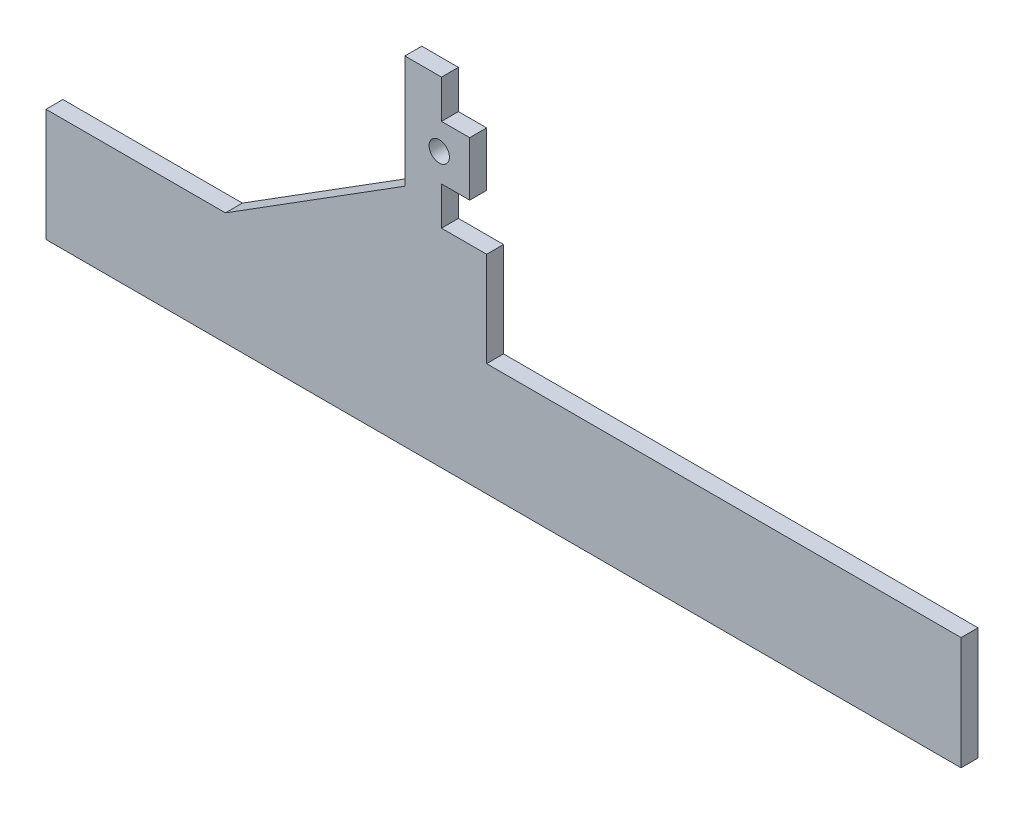
ISO-10303-21;
HEADER;
FILE_DESCRIPTION(('STEP AP214'),'2;1');
FILE_NAME('part.step','',(''),(''),'','','');
FILE_SCHEMA(('AUTOMOTIVE_DESIGN { 1 0 10303 214 1 1 1 1 }'));
ENDSEC;
DATA;
#1=APPLICATION_CONTEXT('core data for automotive mechanical design processes');
#2=APPLICATION_PROTOCOL_DEFINITION('international standard','automotive_design',2000,#1);
#3=PRODUCT_CONTEXT('',#1,'mechanical');
#4=PRODUCT('Part','Part','',(#3));
#5=PRODUCT_RELATED_PRODUCT_CATEGORY('part','',(#4));
#6=PRODUCT_DEFINITION_FORMATION('','',#4);
#7=PRODUCT_DEFINITION_CONTEXT('part definition',#1,'design');
#8=PRODUCT_DEFINITION('design','',#6,#7);
#9=PRODUCT_DEFINITION_SHAPE('','',#8);
#10=(LENGTH_UNIT() NAMED_UNIT(*) SI_UNIT(.MILLI.,.METRE.));
#11=(NAMED_UNIT(*) PLANE_ANGLE_UNIT() SI_UNIT($,.RADIAN.));
#12=(NAMED_UNIT(*) SI_UNIT($,.STERADIAN.) SOLID_ANGLE_UNIT());
#13=UNCERTAINTY_MEASURE_WITH_UNIT(LENGTH_MEASURE(1.E-05),#10,'distance_accuracy_value','');
#14=(GEOMETRIC_REPRESENTATION_CONTEXT(3) GLOBAL_UNCERTAINTY_ASSIGNED_CONTEXT((#13)) GLOBAL_UNIT_ASSIGNED_CONTEXT((#10,
#11,#12)) REPRESENTATION_CONTEXT('',''));
#15=CARTESIAN_POINT('',(0.,0.,0.));
#16=DIRECTION('',(0.,0.,1.));
#17=DIRECTION('',(1.,0.,0.));
#18=AXIS2_PLACEMENT_3D('',#15,#16,#17);
#19=CARTESIAN_POINT('',(0.,0.,15.));
#20=DIRECTION('',(0.,0.,1.));
#21=DIRECTION('',(1.,0.,0.));
#22=AXIS2_PLACEMENT_3D('',#19,#20,#21);
#23=PLANE('',#22);
#24=DIRECTION('',(-1.,0.,0.));
#25=VECTOR('',#24,1.);
#26=CARTESIAN_POINT('',(-15.,50.,15.));
#27=LINE('',#26,#25);
#28=CARTESIAN_POINT('',(405.6,50.,15.));
#29=VERTEX_POINT('',#28);
#30=CARTESIAN_POINT('',(-15.,50.,15.));
#31=VERTEX_POINT('',#30);
#32=EDGE_CURVE('E201',#29,#31,#27,.T.);
#33=ORIENTED_EDGE('',*,*,#32,.T.);
#34=DIRECTION('',(0.,1.,0.));
#35=VECTOR('',#34,1.);
#36=CARTESIAN_POINT('',(-15.,50.,15.));
#37=LINE('',#36,#35);
#38=CARTESIAN_POINT('',(-15.,134.,15.));
#39=VERTEX_POINT('',#38);
#40=EDGE_CURVE('E114',#31,#39,#37,.T.);
#41=ORIENTED_EDGE('',*,*,#40,.T.);
#42=DIRECTION('',(-1.,0.,0.));
#43=VECTOR('',#42,1.);
#44=CARTESIAN_POINT('',(-15.,134.,15.));
#45=LINE('',#44,#43);
#46=CARTESIAN_POINT('',(-55.,134.,15.));
#47=VERTEX_POINT('',#46);
#48=EDGE_CURVE('E237',#39,#47,#45,.T.);
#49=ORIENTED_EDGE('',*,*,#48,.T.);
#50=DIRECTION('',(0.,1.,0.));
#51=VECTOR('',#50,1.);
#52=CARTESIAN_POINT('',(-55.,134.,15.));
#53=LINE('',#52,#51);
#54=CARTESIAN_POINT('',(-55.,168.,15.));
#55=VERTEX_POINT('',#54);
#56=EDGE_CURVE('E256',#47,#55,#53,.T.);
#57=ORIENTED_EDGE('',*,*,#56,.T.);
#58=DIRECTION('',(1.,0.,0.));
#59=VECTOR('',#58,1.);
#60=CARTESIAN_POINT('',(-30.,168.,15.));
#61=LINE('',#60,#59);
#62=CARTESIAN_POINT('',(-30.,168.,15.));
#63=VERTEX_POINT('',#62);
#64=EDGE_CURVE('E253',#55,#63,#61,.T.);
#65=ORIENTED_EDGE('',*,*,#64,.T.);
#66=DIRECTION('',(0.,1.,0.));
#67=VECTOR('',#66,1.);
#68=CARTESIAN_POINT('',(-30.,168.,15.));
#69=LINE('',#68,#67);
#70=CARTESIAN_POINT('',(-30.,216.,15.));
#71=VERTEX_POINT('',#70);
#72=EDGE_CURVE('E255',#63,#71,#69,.T.);
#73=ORIENTED_EDGE('',*,*,#72,.T.);
#74=DIRECTION('',(-1.,0.,0.));
#75=VECTOR('',#74,1.);
#76=CARTESIAN_POINT('',(-30.,216.,15.));
#77=LINE('',#76,#75);
#78=CARTESIAN_POINT('',(-55.,216.,15.));
#79=VERTEX_POINT('',#78);
#80=EDGE_CURVE('E258',#71,#79,#77,.T.);
#81=ORIENTED_EDGE('',*,*,#80,.T.);
#82=DIRECTION('',(0.,1.,0.));
#83=VECTOR('',#82,1.);
#84=CARTESIAN_POINT('',(-55.,250.,15.));
#85=LINE('',#84,#83);
#86=CARTESIAN_POINT('',(-55.,250.,15.));
#87=VERTEX_POINT('',#86);
#88=EDGE_CURVE('E264',#79,#87,#85,.T.);
#89=ORIENTED_EDGE('',*,*,#88,.T.);
#90=DIRECTION('',(-1.,0.,0.));
#91=VECTOR('',#90,1.);
#92=CARTESIAN_POINT('',(-55.,250.,15.));
#93=LINE('',#92,#91);
#94=CARTESIAN_POINT('',(-87.48,250.,15.));
#95=VERTEX_POINT('',#94);
#96=EDGE_CURVE('E266',#87,#95,#93,.T.);
#97=ORIENTED_EDGE('',*,*,#96,.T.);
#98=DIRECTION('',(0.,-1.,0.));
#99=VECTOR('',#98,1.);
#100=CARTESIAN_POINT('',(-87.48,250.,15.));
#101=LINE('',#100,#99);
#102=CARTESIAN_POINT('',(-87.48,150.,15.));
#103=VERTEX_POINT('',#102);
#104=EDGE_CURVE('E268',#95,#103,#101,.T.);
#105=ORIENTED_EDGE('',*,*,#104,.T.);
#106=DIRECTION('',(-0.846589955005853,-0.532245665161482,0.));
#107=VECTOR('',#106,1.);
#108=CARTESIAN_POINT('',(-87.48,150.,15.));
#109=LINE('',#108,#107);
#110=CARTESIAN_POINT('',(-246.54,50.,15.));
#111=VERTEX_POINT('',#110);
#112=EDGE_CURVE('E270',#103,#111,#109,.T.);
#113=ORIENTED_EDGE('',*,*,#112,.T.);
#114=DIRECTION('',(-1.,0.,0.));
#115=VECTOR('',#114,1.);
#116=CARTESIAN_POINT('',(-405.6,50.,15.));
#117=LINE('',#116,#115);
#118=CARTESIAN_POINT('',(-405.6,50.,15.));
#119=VERTEX_POINT('',#118);
#120=EDGE_CURVE('E154',#111,#119,#117,.T.);
#121=ORIENTED_EDGE('',*,*,#120,.T.);
#122=DIRECTION('',(0.,-1.,0.));
#123=VECTOR('',#122,1.);
#124=CARTESIAN_POINT('',(-405.6,-50.,15.));
#125=LINE('',#124,#123);
#126=CARTESIAN_POINT('',(-405.6,-50.,15.));
#127=VERTEX_POINT('',#126);
#128=EDGE_CURVE('E148',#119,#127,#125,.T.);
#129=ORIENTED_EDGE('',*,*,#128,.T.);
#130=DIRECTION('',(1.,0.,0.));
#131=VECTOR('',#130,1.);
#132=CARTESIAN_POINT('',(-405.6,-50.,15.));
#133=LINE('',#132,#131);
#134=CARTESIAN_POINT('',(405.6,-50.,15.));
#135=VERTEX_POINT('',#134);
#136=EDGE_CURVE('E152',#127,#135,#133,.T.);
#137=ORIENTED_EDGE('',*,*,#136,.T.);
#138=DIRECTION('',(0.,1.,0.));
#139=VECTOR('',#138,1.);
#140=CARTESIAN_POINT('',(405.6,-50.,15.));
#141=LINE('',#140,#139);
#142=EDGE_CURVE('E50',#135,#29,#141,.T.);
#143=ORIENTED_EDGE('',*,*,#142,.T.);
#144=EDGE_LOOP('',(#33,#41,#49,#57,#65,#73,#81,#89,#97,#105,#113,#121,#129,#137,#143));
#145=FACE_BOUND('',#144,.T.);
#146=CARTESIAN_POINT('',(-56.98,192.,15.));
#147=DIRECTION('',(0.,0.,1.));
#148=DIRECTION('',(1.,0.,0.));
#149=AXIS2_PLACEMENT_3D('',#146,#147,#148);
#150=CIRCLE('',#149,9.00000000000001);
#151=CARTESIAN_POINT('',(-47.98,192.,15.));
#152=VERTEX_POINT('',#151);
#153=EDGE_CURVE('E176',#152,#152,#150,.T.);
#154=ORIENTED_EDGE('',*,*,#153,.F.);
#155=EDGE_LOOP('',(#154));
#156=FACE_BOUND('',#155,.T.);
#157=ADVANCED_FACE('F33',(#145,#156),#23,.T.);
#158=CARTESIAN_POINT('',(0.,0.,0.));
#159=DIRECTION('',(0.,0.,1.));
#160=DIRECTION('',(1.,0.,0.));
#161=AXIS2_PLACEMENT_3D('',#158,#159,#160);
#162=PLANE('',#161);
#163=DIRECTION('',(-1.,0.,0.));
#164=VECTOR('',#163,1.);
#165=CARTESIAN_POINT('',(-15.,50.,0.));
#166=LINE('',#165,#164);
#167=CARTESIAN_POINT('',(405.6,50.,0.));
#168=VERTEX_POINT('',#167);
#169=CARTESIAN_POINT('',(-15.,50.,0.));
#170=VERTEX_POINT('',#169);
#171=EDGE_CURVE('E172',#168,#170,#166,.T.);
#172=ORIENTED_EDGE('',*,*,#171,.F.);
#173=DIRECTION('',(0.,1.,0.));
#174=VECTOR('',#173,1.);
#175=CARTESIAN_POINT('',(405.6,-50.,0.));
#176=LINE('',#175,#174);
#177=CARTESIAN_POINT('',(405.6,-50.,0.));
#178=VERTEX_POINT('',#177);
#179=EDGE_CURVE('E106',#178,#168,#176,.T.);
#180=ORIENTED_EDGE('',*,*,#179,.F.);
#181=DIRECTION('',(1.,0.,0.));
#182=VECTOR('',#181,1.);
#183=CARTESIAN_POINT('',(-405.6,-50.,0.));
#184=LINE('',#183,#182);
#185=CARTESIAN_POINT('',(-405.6,-50.,0.));
#186=VERTEX_POINT('',#185);
#187=EDGE_CURVE('E100',#186,#178,#184,.T.);
#188=ORIENTED_EDGE('',*,*,#187,.F.);
#189=DIRECTION('',(0.,-1.,0.));
#190=VECTOR('',#189,1.);
#191=CARTESIAN_POINT('',(-405.6,-50.,0.));
#192=LINE('',#191,#190);
#193=CARTESIAN_POINT('',(-405.6,50.,0.));
#194=VERTEX_POINT('',#193);
#195=EDGE_CURVE('E162',#194,#186,#192,.T.);
#196=ORIENTED_EDGE('',*,*,#195,.F.);
#197=DIRECTION('',(-1.,0.,0.));
#198=VECTOR('',#197,1.);
#199=CARTESIAN_POINT('',(-405.6,50.,0.));
#200=LINE('',#199,#198);
#201=CARTESIAN_POINT('',(-246.54,50.,0.));
#202=VERTEX_POINT('',#201);
#203=EDGE_CURVE('E196',#202,#194,#200,.T.);
#204=ORIENTED_EDGE('',*,*,#203,.F.);
#205=DIRECTION('',(-0.846589955005853,-0.532245665161482,0.));
#206=VECTOR('',#205,1.);
#207=CARTESIAN_POINT('',(-87.48,150.,0.));
#208=LINE('',#207,#206);
#209=CARTESIAN_POINT('',(-87.48,150.,0.));
#210=VERTEX_POINT('',#209);
#211=EDGE_CURVE('E194',#210,#202,#208,.T.);
#212=ORIENTED_EDGE('',*,*,#211,.F.);
#213=DIRECTION('',(0.,-1.,0.));
#214=VECTOR('',#213,1.);
#215=CARTESIAN_POINT('',(-87.48,250.,0.));
#216=LINE('',#215,#214);
#217=CARTESIAN_POINT('',(-87.48,250.,0.));
#218=VERTEX_POINT('',#217);
#219=EDGE_CURVE('E192',#218,#210,#216,.T.);
#220=ORIENTED_EDGE('',*,*,#219,.F.);
#221=DIRECTION('',(-1.,0.,0.));
#222=VECTOR('',#221,1.);
#223=CARTESIAN_POINT('',(-55.,250.,0.));
#224=LINE('',#223,#222);
#225=CARTESIAN_POINT('',(-55.,250.,0.));
#226=VERTEX_POINT('',#225);
#227=EDGE_CURVE('E190',#226,#218,#224,.T.);
#228=ORIENTED_EDGE('',*,*,#227,.F.);
#229=DIRECTION('',(0.,1.,0.));
#230=VECTOR('',#229,1.);
#231=CARTESIAN_POINT('',(-55.,250.,0.));
#232=LINE('',#231,#230);
#233=CARTESIAN_POINT('',(-55.,216.,0.));
#234=VERTEX_POINT('',#233);
#235=EDGE_CURVE('E188',#234,#226,#232,.T.);
#236=ORIENTED_EDGE('',*,*,#235,.F.);
#237=DIRECTION('',(-1.,0.,0.));
#238=VECTOR('',#237,1.);
#239=CARTESIAN_POINT('',(-30.,216.,0.));
#240=LINE('',#239,#238);
#241=CARTESIAN_POINT('',(-30.,216.,0.));
#242=VERTEX_POINT('',#241);
#243=EDGE_CURVE('E186',#242,#234,#240,.T.);
#244=ORIENTED_EDGE('',*,*,#243,.F.);
#245=DIRECTION('',(0.,1.,0.));
#246=VECTOR('',#245,1.);
#247=CARTESIAN_POINT('',(-30.,168.,0.));
#248=LINE('',#247,#246);
#249=CARTESIAN_POINT('',(-30.,168.,0.));
#250=VERTEX_POINT('',#249);
#251=EDGE_CURVE('E184',#250,#242,#248,.T.);
#252=ORIENTED_EDGE('',*,*,#251,.F.);
#253=DIRECTION('',(1.,0.,0.));
#254=VECTOR('',#253,1.);
#255=CARTESIAN_POINT('',(-30.,168.,0.));
#256=LINE('',#255,#254);
#257=CARTESIAN_POINT('',(-55.,168.,0.));
#258=VERTEX_POINT('',#257);
#259=EDGE_CURVE('E182',#258,#250,#256,.T.);
#260=ORIENTED_EDGE('',*,*,#259,.F.);
#261=DIRECTION('',(0.,1.,0.));
#262=VECTOR('',#261,1.);
#263=CARTESIAN_POINT('',(-55.,134.,0.));
#264=LINE('',#263,#262);
#265=CARTESIAN_POINT('',(-55.,134.,0.));
#266=VERTEX_POINT('',#265);
#267=EDGE_CURVE('E180',#266,#258,#264,.T.);
#268=ORIENTED_EDGE('',*,*,#267,.F.);
#269=DIRECTION('',(-1.,0.,0.));
#270=VECTOR('',#269,1.);
#271=CARTESIAN_POINT('',(-15.,134.,0.));
#272=LINE('',#271,#270);
#273=CARTESIAN_POINT('',(-15.,134.,0.));
#274=VERTEX_POINT('',#273);
#275=EDGE_CURVE('E178',#274,#266,#272,.T.);
#276=ORIENTED_EDGE('',*,*,#275,.F.);
#277=DIRECTION('',(0.,1.,0.));
#278=VECTOR('',#277,1.);
#279=CARTESIAN_POINT('',(-15.,50.,0.));
#280=LINE('',#279,#278);
#281=EDGE_CURVE('E175',#170,#274,#280,.T.);
#282=ORIENTED_EDGE('',*,*,#281,.F.);
#283=EDGE_LOOP('',(#172,#180,#188,#196,#204,#212,#220,#228,#236,#244,#252,#260,#268,#276,#282));
#284=FACE_BOUND('',#283,.T.);
#285=CARTESIAN_POINT('',(-56.98,192.,0.));
#286=DIRECTION('',(0.,0.,1.));
#287=DIRECTION('',(1.,0.,0.));
#288=AXIS2_PLACEMENT_3D('',#285,#286,#287);
#289=CIRCLE('',#288,9.00000000000001);
#290=CARTESIAN_POINT('',(-47.98,192.,0.));
#291=VERTEX_POINT('',#290);
#292=EDGE_CURVE('E456',#291,#291,#289,.T.);
#293=ORIENTED_EDGE('',*,*,#292,.T.);
#294=EDGE_LOOP('',(#293));
#295=FACE_BOUND('',#294,.T.);
#296=ADVANCED_FACE('F241',(#284,#295),#162,.F.);
#297=CARTESIAN_POINT('',(-15.,50.,15.));
#298=DIRECTION('',(0.,-1.,0.));
#299=DIRECTION('',(0.,0.,-1.));
#300=AXIS2_PLACEMENT_3D('',#297,#298,#299);
#301=PLANE('',#300);
#302=ORIENTED_EDGE('',*,*,#171,.T.);
#303=DIRECTION('',(0.,0.,-1.));
#304=VECTOR('',#303,1.);
#305=CARTESIAN_POINT('',(-15.,50.,15.));
#306=LINE('',#305,#304);
#307=EDGE_CURVE('E11',#31,#170,#306,.T.);
#308=ORIENTED_EDGE('',*,*,#307,.F.);
#309=ORIENTED_EDGE('',*,*,#32,.F.);
#310=DIRECTION('',(0.,0.,-1.));
#311=VECTOR('',#310,1.);
#312=CARTESIAN_POINT('',(405.6,50.,15.));
#313=LINE('',#312,#311);
#314=EDGE_CURVE('E168',#29,#168,#313,.T.);
#315=ORIENTED_EDGE('',*,*,#314,.T.);
#316=EDGE_LOOP('',(#302,#308,#309,#315));
#317=FACE_BOUND('',#316,.T.);
#318=ADVANCED_FACE('F35',(#317),#301,.F.);
#319=CARTESIAN_POINT('',(-15.,50.,15.));
#320=DIRECTION('',(-1.,0.,0.));
#321=DIRECTION('',(0.,0.,1.));
#322=AXIS2_PLACEMENT_3D('',#319,#320,#321);
#323=PLANE('',#322);
#324=ORIENTED_EDGE('',*,*,#281,.T.);
#325=DIRECTION('',(0.,0.,-1.));
#326=VECTOR('',#325,1.);
#327=CARTESIAN_POINT('',(-15.,134.,15.));
#328=LINE('',#327,#326);
#329=EDGE_CURVE('E42',#39,#274,#328,.T.);
#330=ORIENTED_EDGE('',*,*,#329,.F.);
#331=ORIENTED_EDGE('',*,*,#40,.F.);
#332=ORIENTED_EDGE('',*,*,#307,.T.);
#333=EDGE_LOOP('',(#324,#330,#331,#332));
#334=FACE_BOUND('',#333,.T.);
#335=ADVANCED_FACE('F304',(#334),#323,.F.);
#336=CARTESIAN_POINT('',(-15.,134.,15.));
#337=DIRECTION('',(0.,-1.,0.));
#338=DIRECTION('',(1.,0.,0.));
#339=AXIS2_PLACEMENT_3D('',#336,#337,#338);
#340=PLANE('',#339);
#341=ORIENTED_EDGE('',*,*,#275,.T.);
#342=DIRECTION('',(0.,0.,-1.));
#343=VECTOR('',#342,1.);
#344=CARTESIAN_POINT('',(-55.,134.,15.));
#345=LINE('',#344,#343);
#346=EDGE_CURVE('E229',#47,#266,#345,.T.);
#347=ORIENTED_EDGE('',*,*,#346,.F.);
#348=ORIENTED_EDGE('',*,*,#48,.F.);
#349=ORIENTED_EDGE('',*,*,#329,.T.);
#350=EDGE_LOOP('',(#341,#347,#348,#349));
#351=FACE_BOUND('',#350,.T.);
#352=ADVANCED_FACE('F235',(#351),#340,.F.);
#353=CARTESIAN_POINT('',(-55.,134.,15.));
#354=DIRECTION('',(-1.,0.,0.));
#355=DIRECTION('',(0.,0.,1.));
#356=AXIS2_PLACEMENT_3D('',#353,#354,#355);
#357=PLANE('',#356);
#358=ORIENTED_EDGE('',*,*,#267,.T.);
#359=DIRECTION('',(0.,0.,-1.));
#360=VECTOR('',#359,1.);
#361=CARTESIAN_POINT('',(-55.,168.,15.));
#362=LINE('',#361,#360);
#363=EDGE_CURVE('E226',#55,#258,#362,.T.);
#364=ORIENTED_EDGE('',*,*,#363,.F.);
#365=ORIENTED_EDGE('',*,*,#56,.F.);
#366=ORIENTED_EDGE('',*,*,#346,.T.);
#367=EDGE_LOOP('',(#358,#364,#365,#366));
#368=FACE_BOUND('',#367,.T.);
#369=ADVANCED_FACE('F247',(#368),#357,.F.);
#370=CARTESIAN_POINT('',(-30.,168.,15.));
#371=DIRECTION('',(0.,1.,0.));
#372=DIRECTION('',(0.,0.,1.));
#373=AXIS2_PLACEMENT_3D('',#370,#371,#372);
#374=PLANE('',#373);
#375=ORIENTED_EDGE('',*,*,#259,.T.);
#376=DIRECTION('',(0.,0.,-1.));
#377=VECTOR('',#376,1.);
#378=CARTESIAN_POINT('',(-30.,168.,15.));
#379=LINE('',#378,#377);
#380=EDGE_CURVE('E223',#63,#250,#379,.T.);
#381=ORIENTED_EDGE('',*,*,#380,.F.);
#382=ORIENTED_EDGE('',*,*,#64,.F.);
#383=ORIENTED_EDGE('',*,*,#363,.T.);
#384=EDGE_LOOP('',(#375,#381,#382,#383));
#385=FACE_BOUND('',#384,.T.);
#386=ADVANCED_FACE('F251',(#385),#374,.F.);
#387=CARTESIAN_POINT('',(-30.,168.,15.));
#388=DIRECTION('',(-1.,0.,0.));
#389=DIRECTION('',(0.,0.,1.));
#390=AXIS2_PLACEMENT_3D('',#387,#388,#389);
#391=PLANE('',#390);
#392=ORIENTED_EDGE('',*,*,#251,.T.);
#393=DIRECTION('',(0.,0.,-1.));
#394=VECTOR('',#393,1.);
#395=CARTESIAN_POINT('',(-30.,216.,15.));
#396=LINE('',#395,#394);
#397=EDGE_CURVE('E220',#71,#242,#396,.T.);
#398=ORIENTED_EDGE('',*,*,#397,.F.);
#399=ORIENTED_EDGE('',*,*,#72,.F.);
#400=ORIENTED_EDGE('',*,*,#380,.T.);
#401=EDGE_LOOP('',(#392,#398,#399,#400));
#402=FACE_BOUND('',#401,.T.);
#403=ADVANCED_FACE('F317',(#402),#391,.F.);
#404=CARTESIAN_POINT('',(-30.,216.,15.));
#405=DIRECTION('',(0.,-1.,0.));
#406=DIRECTION('',(0.,0.,-1.));
#407=AXIS2_PLACEMENT_3D('',#404,#405,#406);
#408=PLANE('',#407);
#409=ORIENTED_EDGE('',*,*,#243,.T.);
#410=DIRECTION('',(0.,0.,-1.));
#411=VECTOR('',#410,1.);
#412=CARTESIAN_POINT('',(-55.,216.,15.));
#413=LINE('',#412,#411);
#414=EDGE_CURVE('E217',#79,#234,#413,.T.);
#415=ORIENTED_EDGE('',*,*,#414,.F.);
#416=ORIENTED_EDGE('',*,*,#80,.F.);
#417=ORIENTED_EDGE('',*,*,#397,.T.);
#418=EDGE_LOOP('',(#409,#415,#416,#417));
#419=FACE_BOUND('',#418,.T.);
#420=ADVANCED_FACE('F320',(#419),#408,.F.);
#421=CARTESIAN_POINT('',(-55.,250.,15.));
#422=DIRECTION('',(-1.,0.,0.));
#423=DIRECTION('',(0.,-1.,0.));
#424=AXIS2_PLACEMENT_3D('',#421,#422,#423);
#425=PLANE('',#424);
#426=ORIENTED_EDGE('',*,*,#235,.T.);
#427=DIRECTION('',(0.,0.,-1.));
#428=VECTOR('',#427,1.);
#429=CARTESIAN_POINT('',(-55.,250.,15.));
#430=LINE('',#429,#428);
#431=EDGE_CURVE('E214',#87,#226,#430,.T.);
#432=ORIENTED_EDGE('',*,*,#431,.F.);
#433=ORIENTED_EDGE('',*,*,#88,.F.);
#434=ORIENTED_EDGE('',*,*,#414,.T.);
#435=EDGE_LOOP('',(#426,#432,#433,#434));
#436=FACE_BOUND('',#435,.T.);
#437=ADVANCED_FACE('F324',(#436),#425,.F.);
#438=CARTESIAN_POINT('',(-55.,250.,15.));
#439=DIRECTION('',(0.,-1.,0.));
#440=DIRECTION('',(0.,0.,-1.));
#441=AXIS2_PLACEMENT_3D('',#438,#439,#440);
#442=PLANE('',#441);
#443=ORIENTED_EDGE('',*,*,#227,.T.);
#444=DIRECTION('',(0.,0.,-1.));
#445=VECTOR('',#444,1.);
#446=CARTESIAN_POINT('',(-87.48,250.,15.));
#447=LINE('',#446,#445);
#448=EDGE_CURVE('E211',#95,#218,#447,.T.);
#449=ORIENTED_EDGE('',*,*,#448,.F.);
#450=ORIENTED_EDGE('',*,*,#96,.F.);
#451=ORIENTED_EDGE('',*,*,#431,.T.);
#452=EDGE_LOOP('',(#443,#449,#450,#451));
#453=FACE_BOUND('',#452,.T.);
#454=ADVANCED_FACE('F328',(#453),#442,.F.);
#455=CARTESIAN_POINT('',(-87.48,250.,15.));
#456=DIRECTION('',(1.,0.,0.));
#457=DIRECTION('',(0.,1.,0.));
#458=AXIS2_PLACEMENT_3D('',#455,#456,#457);
#459=PLANE('',#458);
#460=ORIENTED_EDGE('',*,*,#219,.T.);
#461=DIRECTION('',(0.,0.,-1.));
#462=VECTOR('',#461,1.);
#463=CARTESIAN_POINT('',(-87.48,150.,15.));
#464=LINE('',#463,#462);
#465=EDGE_CURVE('E208',#103,#210,#464,.T.);
#466=ORIENTED_EDGE('',*,*,#465,.F.);
#467=ORIENTED_EDGE('',*,*,#104,.F.);
#468=ORIENTED_EDGE('',*,*,#448,.T.);
#469=EDGE_LOOP('',(#460,#466,#467,#468));
#470=FACE_BOUND('',#469,.T.);
#471=ADVANCED_FACE('F332',(#470),#459,.F.);
#472=CARTESIAN_POINT('',(-87.48,150.,15.));
#473=DIRECTION('',(0.532245665161482,-0.846589955005853,0.));
#474=DIRECTION('',(0.846589955005853,0.532245665161482,0.));
#475=AXIS2_PLACEMENT_3D('',#472,#473,#474);
#476=PLANE('',#475);
#477=ORIENTED_EDGE('',*,*,#211,.T.);
#478=DIRECTION('',(0.,0.,-1.));
#479=VECTOR('',#478,1.);
#480=CARTESIAN_POINT('',(-246.54,50.,15.));
#481=LINE('',#480,#479);
#482=EDGE_CURVE('E205',#111,#202,#481,.T.);
#483=ORIENTED_EDGE('',*,*,#482,.F.);
#484=ORIENTED_EDGE('',*,*,#112,.F.);
#485=ORIENTED_EDGE('',*,*,#465,.T.);
#486=EDGE_LOOP('',(#477,#483,#484,#485));
#487=FACE_BOUND('',#486,.T.);
#488=ADVANCED_FACE('F276',(#487),#476,.F.);
#489=CARTESIAN_POINT('',(-405.6,50.,15.));
#490=DIRECTION('',(0.,-1.,0.));
#491=DIRECTION('',(0.,0.,-1.));
#492=AXIS2_PLACEMENT_3D('',#489,#490,#491);
#493=PLANE('',#492);
#494=ORIENTED_EDGE('',*,*,#203,.T.);
#495=DIRECTION('',(0.,0.,-1.));
#496=VECTOR('',#495,1.);
#497=CARTESIAN_POINT('',(-405.6,50.,15.));
#498=LINE('',#497,#496);
#499=EDGE_CURVE('E163',#119,#194,#498,.T.);
#500=ORIENTED_EDGE('',*,*,#499,.F.);
#501=ORIENTED_EDGE('',*,*,#120,.F.);
#502=ORIENTED_EDGE('',*,*,#482,.T.);
#503=EDGE_LOOP('',(#494,#500,#501,#502));
#504=FACE_BOUND('',#503,.T.);
#505=ADVANCED_FACE('F280',(#504),#493,.F.);
#506=CARTESIAN_POINT('',(-405.6,-50.,15.));
#507=DIRECTION('',(1.,0.,0.));
#508=DIRECTION('',(0.,0.,-1.));
#509=AXIS2_PLACEMENT_3D('',#506,#507,#508);
#510=PLANE('',#509);
#511=ORIENTED_EDGE('',*,*,#195,.T.);
#512=DIRECTION('',(0.,0.,-1.));
#513=VECTOR('',#512,1.);
#514=CARTESIAN_POINT('',(-405.6,-50.,15.));
#515=LINE('',#514,#513);
#516=EDGE_CURVE('E159',#127,#186,#515,.T.);
#517=ORIENTED_EDGE('',*,*,#516,.F.);
#518=ORIENTED_EDGE('',*,*,#128,.F.);
#519=ORIENTED_EDGE('',*,*,#499,.T.);
#520=EDGE_LOOP('',(#511,#517,#518,#519));
#521=FACE_BOUND('',#520,.T.);
#522=ADVANCED_FACE('F160',(#521),#510,.F.);
#523=CARTESIAN_POINT('',(-405.6,-50.,15.));
#524=DIRECTION('',(0.,1.,0.));
#525=DIRECTION('',(0.,0.,1.));
#526=AXIS2_PLACEMENT_3D('',#523,#524,#525);
#527=PLANE('',#526);
#528=ORIENTED_EDGE('',*,*,#187,.T.);
#529=DIRECTION('',(0.,0.,-1.));
#530=VECTOR('',#529,1.);
#531=CARTESIAN_POINT('',(405.6,-50.,15.));
#532=LINE('',#531,#530);
#533=EDGE_CURVE('E164',#135,#178,#532,.T.);
#534=ORIENTED_EDGE('',*,*,#533,.F.);
#535=ORIENTED_EDGE('',*,*,#136,.F.);
#536=ORIENTED_EDGE('',*,*,#516,.T.);
#537=EDGE_LOOP('',(#528,#534,#535,#536));
#538=FACE_BOUND('',#537,.T.);
#539=ADVANCED_FACE('F166',(#538),#527,.F.);
#540=CARTESIAN_POINT('',(405.6,-50.,15.));
#541=DIRECTION('',(-1.,0.,0.));
#542=DIRECTION('',(0.,0.,1.));
#543=AXIS2_PLACEMENT_3D('',#540,#541,#542);
#544=PLANE('',#543);
#545=ORIENTED_EDGE('',*,*,#179,.T.);
#546=ORIENTED_EDGE('',*,*,#314,.F.);
#547=ORIENTED_EDGE('',*,*,#142,.F.);
#548=ORIENTED_EDGE('',*,*,#533,.T.);
#549=EDGE_LOOP('',(#545,#546,#547,#548));
#550=FACE_BOUND('',#549,.T.);
#551=ADVANCED_FACE('F284',(#550),#544,.F.);
#552=CARTESIAN_POINT('',(-56.98,192.,15.));
#553=DIRECTION('',(0.,0.,-1.));
#554=DIRECTION('',(-1.,0.,0.));
#555=AXIS2_PLACEMENT_3D('',#552,#553,#554);
#556=CYLINDRICAL_SURFACE('',#555,9.00000000000001);
#557=ORIENTED_EDGE('',*,*,#153,.T.);
#558=EDGE_LOOP('',(#557));
#559=FACE_BOUND('',#558,.T.);
#560=ORIENTED_EDGE('',*,*,#292,.F.);
#561=EDGE_LOOP('',(#560));
#562=FACE_BOUND('',#561,.T.);
#563=ADVANCED_FACE('F286',(#559,#562),#556,.F.);
#564=CLOSED_SHELL('',(#157,#296,#318,#335,#352,#369,#386,#403,#420,#437,#454,#471,#488,#505,
#522,#539,#551,#563));
#565=MANIFOLD_SOLID_BREP('B2',#564);
#566=ADVANCED_BREP_SHAPE_REPRESENTATION('',(#18,#565),#14);
#567=SHAPE_DEFINITION_REPRESENTATION(#9,#566);
ENDSEC;
END-ISO-10303-21;
